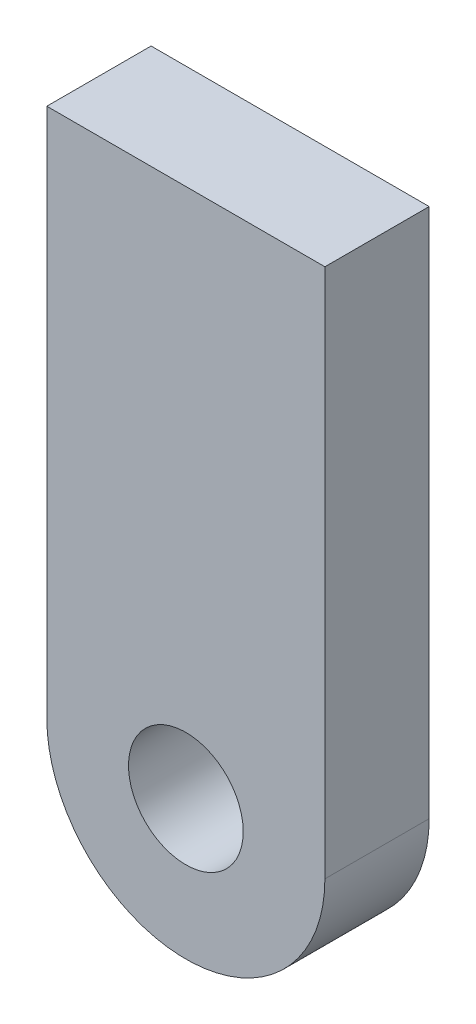
ISO-10303-21;
HEADER;
FILE_DESCRIPTION(('STEP AP214'),'2;1');
FILE_NAME('part.step','',(''),(''),'','','');
FILE_SCHEMA(('AUTOMOTIVE_DESIGN { 1 0 10303 214 1 1 1 1 }'));
ENDSEC;
DATA;
#1=APPLICATION_CONTEXT('core data for automotive mechanical design processes');
#2=APPLICATION_PROTOCOL_DEFINITION('international standard','automotive_design',2000,#1);
#3=PRODUCT_CONTEXT('',#1,'mechanical');
#4=PRODUCT('Part','Part','',(#3));
#5=PRODUCT_RELATED_PRODUCT_CATEGORY('part','',(#4));
#6=PRODUCT_DEFINITION_FORMATION('','',#4);
#7=PRODUCT_DEFINITION_CONTEXT('part definition',#1,'design');
#8=PRODUCT_DEFINITION('design','',#6,#7);
#9=PRODUCT_DEFINITION_SHAPE('','',#8);
#10=(LENGTH_UNIT() NAMED_UNIT(*) SI_UNIT(.MILLI.,.METRE.));
#11=(NAMED_UNIT(*) PLANE_ANGLE_UNIT() SI_UNIT($,.RADIAN.));
#12=(NAMED_UNIT(*) SI_UNIT($,.STERADIAN.) SOLID_ANGLE_UNIT());
#13=UNCERTAINTY_MEASURE_WITH_UNIT(LENGTH_MEASURE(1.E-05),#10,'distance_accuracy_value','');
#14=(GEOMETRIC_REPRESENTATION_CONTEXT(3) GLOBAL_UNCERTAINTY_ASSIGNED_CONTEXT((#13)) GLOBAL_UNIT_ASSIGNED_CONTEXT((#10,
#11,#12)) REPRESENTATION_CONTEXT('',''));
#15=CARTESIAN_POINT('',(0.,0.,0.));
#16=DIRECTION('',(0.,0.,1.));
#17=DIRECTION('',(1.,0.,0.));
#18=AXIS2_PLACEMENT_3D('',#15,#16,#17);
#19=CARTESIAN_POINT('',(0.,0.,3.));
#20=DIRECTION('',(0.,0.,1.));
#21=DIRECTION('',(1.,0.,0.));
#22=AXIS2_PLACEMENT_3D('',#19,#20,#21);
#23=PLANE('',#22);
#24=CARTESIAN_POINT('',(0.,0.,3.));
#25=DIRECTION('',(0.,0.,1.));
#26=DIRECTION('',(1.,0.,0.));
#27=AXIS2_PLACEMENT_3D('',#24,#25,#26);
#28=CIRCLE('',#27,4.);
#29=CARTESIAN_POINT('',(-4.,0.,3.));
#30=VERTEX_POINT('',#29);
#31=CARTESIAN_POINT('',(4.,0.,3.));
#32=VERTEX_POINT('',#31);
#33=EDGE_CURVE('E86',#30,#32,#28,.T.);
#34=ORIENTED_EDGE('',*,*,#33,.T.);
#35=DIRECTION('',(0.,1.,0.));
#36=VECTOR('',#35,1.);
#37=CARTESIAN_POINT('',(4.,0.,3.));
#38=LINE('',#37,#36);
#39=CARTESIAN_POINT('',(4.,15.25,3.));
#40=VERTEX_POINT('',#39);
#41=EDGE_CURVE('E81',#32,#40,#38,.T.);
#42=ORIENTED_EDGE('',*,*,#41,.T.);
#43=DIRECTION('',(-1.,0.,0.));
#44=VECTOR('',#43,1.);
#45=CARTESIAN_POINT('',(-4.,15.25,3.));
#46=LINE('',#45,#44);
#47=CARTESIAN_POINT('',(-4.,15.25,3.));
#48=VERTEX_POINT('',#47);
#49=EDGE_CURVE('E84',#40,#48,#46,.T.);
#50=ORIENTED_EDGE('',*,*,#49,.T.);
#51=DIRECTION('',(0.,-1.,0.));
#52=VECTOR('',#51,1.);
#53=CARTESIAN_POINT('',(-4.,0.,3.));
#54=LINE('',#53,#52);
#55=EDGE_CURVE('E51',#48,#30,#54,.T.);
#56=ORIENTED_EDGE('',*,*,#55,.T.);
#57=EDGE_LOOP('',(#34,#42,#50,#56));
#58=FACE_BOUND('',#57,.T.);
#59=CARTESIAN_POINT('',(0.,0.,3.));
#60=DIRECTION('',(0.,0.,1.));
#61=DIRECTION('',(1.,0.,0.));
#62=AXIS2_PLACEMENT_3D('',#59,#60,#61);
#63=CIRCLE('',#62,1.65);
#64=CARTESIAN_POINT('',(1.65,0.,3.));
#65=VERTEX_POINT('',#64);
#66=EDGE_CURVE('E101',#65,#65,#63,.T.);
#67=ORIENTED_EDGE('',*,*,#66,.F.);
#68=EDGE_LOOP('',(#67));
#69=FACE_BOUND('',#68,.T.);
#70=ADVANCED_FACE('F34',(#58,#69),#23,.T.);
#71=CARTESIAN_POINT('',(0.,0.,0.));
#72=DIRECTION('',(0.,0.,1.));
#73=DIRECTION('',(1.,0.,0.));
#74=AXIS2_PLACEMENT_3D('',#71,#72,#73);
#75=PLANE('',#74);
#76=CARTESIAN_POINT('',(0.,0.,0.));
#77=DIRECTION('',(0.,0.,1.));
#78=DIRECTION('',(1.,0.,0.));
#79=AXIS2_PLACEMENT_3D('',#76,#77,#78);
#80=CIRCLE('',#79,4.);
#81=CARTESIAN_POINT('',(-4.,0.,0.));
#82=VERTEX_POINT('',#81);
#83=CARTESIAN_POINT('',(4.,0.,0.));
#84=VERTEX_POINT('',#83);
#85=EDGE_CURVE('E98',#82,#84,#80,.T.);
#86=ORIENTED_EDGE('',*,*,#85,.F.);
#87=DIRECTION('',(0.,-1.,0.));
#88=VECTOR('',#87,1.);
#89=CARTESIAN_POINT('',(-4.,0.,0.));
#90=LINE('',#89,#88);
#91=CARTESIAN_POINT('',(-4.,15.25,0.));
#92=VERTEX_POINT('',#91);
#93=EDGE_CURVE('E74',#92,#82,#90,.T.);
#94=ORIENTED_EDGE('',*,*,#93,.F.);
#95=DIRECTION('',(-1.,0.,0.));
#96=VECTOR('',#95,1.);
#97=CARTESIAN_POINT('',(-4.,15.25,0.));
#98=LINE('',#97,#96);
#99=CARTESIAN_POINT('',(4.,15.25,0.));
#100=VERTEX_POINT('',#99);
#101=EDGE_CURVE('E68',#100,#92,#98,.T.);
#102=ORIENTED_EDGE('',*,*,#101,.F.);
#103=DIRECTION('',(0.,1.,0.));
#104=VECTOR('',#103,1.);
#105=CARTESIAN_POINT('',(4.,0.,0.));
#106=LINE('',#105,#104);
#107=EDGE_CURVE('E90',#84,#100,#106,.T.);
#108=ORIENTED_EDGE('',*,*,#107,.F.);
#109=EDGE_LOOP('',(#86,#94,#102,#108));
#110=FACE_BOUND('',#109,.T.);
#111=CARTESIAN_POINT('',(0.,0.,0.));
#112=DIRECTION('',(0.,0.,1.));
#113=DIRECTION('',(1.,0.,0.));
#114=AXIS2_PLACEMENT_3D('',#111,#112,#113);
#115=CIRCLE('',#114,1.65);
#116=CARTESIAN_POINT('',(1.65,0.,0.));
#117=VERTEX_POINT('',#116);
#118=EDGE_CURVE('E113',#117,#117,#115,.T.);
#119=ORIENTED_EDGE('',*,*,#118,.T.);
#120=EDGE_LOOP('',(#119));
#121=FACE_BOUND('',#120,.T.);
#122=ADVANCED_FACE('F109',(#110,#121),#75,.F.);
#123=CARTESIAN_POINT('',(0.,0.,3.));
#124=DIRECTION('',(0.,0.,-1.));
#125=DIRECTION('',(-1.,0.,0.));
#126=AXIS2_PLACEMENT_3D('',#123,#124,#125);
#127=CYLINDRICAL_SURFACE('',#126,4.);
#128=ORIENTED_EDGE('',*,*,#85,.T.);
#129=DIRECTION('',(0.,0.,-1.));
#130=VECTOR('',#129,1.);
#131=CARTESIAN_POINT('',(4.,0.,3.));
#132=LINE('',#131,#130);
#133=EDGE_CURVE('E11',#32,#84,#132,.T.);
#134=ORIENTED_EDGE('',*,*,#133,.F.);
#135=ORIENTED_EDGE('',*,*,#33,.F.);
#136=DIRECTION('',(0.,0.,-1.));
#137=VECTOR('',#136,1.);
#138=CARTESIAN_POINT('',(-4.,0.,3.));
#139=LINE('',#138,#137);
#140=EDGE_CURVE('E94',#30,#82,#139,.T.);
#141=ORIENTED_EDGE('',*,*,#140,.T.);
#142=EDGE_LOOP('',(#128,#134,#135,#141));
#143=FACE_BOUND('',#142,.T.);
#144=ADVANCED_FACE('F36',(#143),#127,.T.);
#145=CARTESIAN_POINT('',(4.,0.,3.));
#146=DIRECTION('',(-1.,0.,0.));
#147=DIRECTION('',(0.,-1.,0.));
#148=AXIS2_PLACEMENT_3D('',#145,#146,#147);
#149=PLANE('',#148);
#150=ORIENTED_EDGE('',*,*,#107,.T.);
#151=DIRECTION('',(0.,0.,-1.));
#152=VECTOR('',#151,1.);
#153=CARTESIAN_POINT('',(4.,15.25,3.));
#154=LINE('',#153,#152);
#155=EDGE_CURVE('E43',#40,#100,#154,.T.);
#156=ORIENTED_EDGE('',*,*,#155,.F.);
#157=ORIENTED_EDGE('',*,*,#41,.F.);
#158=ORIENTED_EDGE('',*,*,#133,.T.);
#159=EDGE_LOOP('',(#150,#156,#157,#158));
#160=FACE_BOUND('',#159,.T.);
#161=ADVANCED_FACE('F89',(#160),#149,.F.);
#162=CARTESIAN_POINT('',(-4.,15.25,3.));
#163=DIRECTION('',(0.,-1.,0.));
#164=DIRECTION('',(1.,0.,0.));
#165=AXIS2_PLACEMENT_3D('',#162,#163,#164);
#166=PLANE('',#165);
#167=ORIENTED_EDGE('',*,*,#101,.T.);
#168=DIRECTION('',(0.,0.,-1.));
#169=VECTOR('',#168,1.);
#170=CARTESIAN_POINT('',(-4.,15.25,3.));
#171=LINE('',#170,#169);
#172=EDGE_CURVE('E91',#48,#92,#171,.T.);
#173=ORIENTED_EDGE('',*,*,#172,.F.);
#174=ORIENTED_EDGE('',*,*,#49,.F.);
#175=ORIENTED_EDGE('',*,*,#155,.T.);
#176=EDGE_LOOP('',(#167,#173,#174,#175));
#177=FACE_BOUND('',#176,.T.);
#178=ADVANCED_FACE('F92',(#177),#166,.F.);
#179=CARTESIAN_POINT('',(-4.,0.,3.));
#180=DIRECTION('',(1.,0.,0.));
#181=DIRECTION('',(0.,0.,-1.));
#182=AXIS2_PLACEMENT_3D('',#179,#180,#181);
#183=PLANE('',#182);
#184=ORIENTED_EDGE('',*,*,#93,.T.);
#185=ORIENTED_EDGE('',*,*,#140,.F.);
#186=ORIENTED_EDGE('',*,*,#55,.F.);
#187=ORIENTED_EDGE('',*,*,#172,.T.);
#188=EDGE_LOOP('',(#184,#185,#186,#187));
#189=FACE_BOUND('',#188,.T.);
#190=ADVANCED_FACE('F106',(#189),#183,.F.);
#191=CARTESIAN_POINT('',(0.,0.,3.));
#192=DIRECTION('',(0.,0.,-1.));
#193=DIRECTION('',(-1.,0.,0.));
#194=AXIS2_PLACEMENT_3D('',#191,#192,#193);
#195=CYLINDRICAL_SURFACE('',#194,1.65);
#196=ORIENTED_EDGE('',*,*,#66,.T.);
#197=EDGE_LOOP('',(#196));
#198=FACE_BOUND('',#197,.T.);
#199=ORIENTED_EDGE('',*,*,#118,.F.);
#200=EDGE_LOOP('',(#199));
#201=FACE_BOUND('',#200,.T.);
#202=ADVANCED_FACE('F119',(#198,#201),#195,.F.);
#203=CLOSED_SHELL('',(#70,#122,#144,#161,#178,#190,#202));
#204=MANIFOLD_SOLID_BREP('B2',#203);
#205=ADVANCED_BREP_SHAPE_REPRESENTATION('',(#18,#204),#14);
#206=SHAPE_DEFINITION_REPRESENTATION(#9,#205);
ENDSEC;
END-ISO-10303-21;
